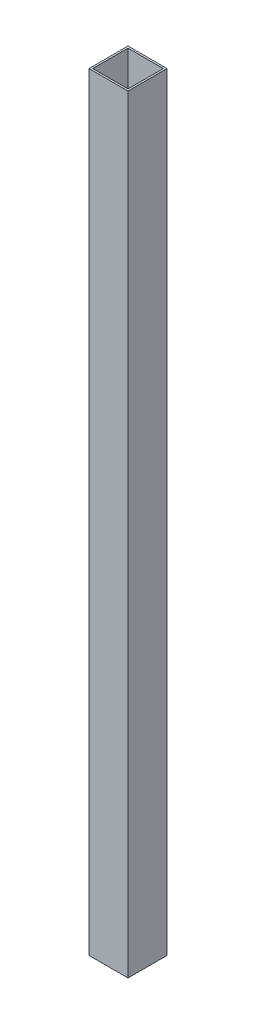
ISO-10303-21;
HEADER;
FILE_DESCRIPTION(('STEP AP214'),'2;1');
FILE_NAME('part.step','',(''),(''),'','','');
FILE_SCHEMA(('AUTOMOTIVE_DESIGN { 1 0 10303 214 1 1 1 1 }'));
ENDSEC;
DATA;
#1=APPLICATION_CONTEXT('core data for automotive mechanical design processes');
#2=APPLICATION_PROTOCOL_DEFINITION('international standard','automotive_design',2000,#1);
#3=PRODUCT_CONTEXT('',#1,'mechanical');
#4=PRODUCT('Part','Part','',(#3));
#5=PRODUCT_RELATED_PRODUCT_CATEGORY('part','',(#4));
#6=PRODUCT_DEFINITION_FORMATION('','',#4);
#7=PRODUCT_DEFINITION_CONTEXT('part definition',#1,'design');
#8=PRODUCT_DEFINITION('design','',#6,#7);
#9=PRODUCT_DEFINITION_SHAPE('','',#8);
#10=(LENGTH_UNIT() NAMED_UNIT(*) SI_UNIT(.MILLI.,.METRE.));
#11=(NAMED_UNIT(*) PLANE_ANGLE_UNIT() SI_UNIT($,.RADIAN.));
#12=(NAMED_UNIT(*) SI_UNIT($,.STERADIAN.) SOLID_ANGLE_UNIT());
#13=UNCERTAINTY_MEASURE_WITH_UNIT(LENGTH_MEASURE(1.E-05),#10,'distance_accuracy_value','');
#14=(GEOMETRIC_REPRESENTATION_CONTEXT(3) GLOBAL_UNCERTAINTY_ASSIGNED_CONTEXT((#13)) GLOBAL_UNIT_ASSIGNED_CONTEXT((#10,
#11,#12)) REPRESENTATION_CONTEXT('',''));
#15=CARTESIAN_POINT('',(0.,0.,0.));
#16=DIRECTION('',(0.,0.,1.));
#17=DIRECTION('',(1.,0.,0.));
#18=AXIS2_PLACEMENT_3D('',#15,#16,#17);
#19=CARTESIAN_POINT('',(0.,250.,0.));
#20=DIRECTION('',(0.,-1.,0.));
#21=DIRECTION('',(0.,0.,-1.));
#22=AXIS2_PLACEMENT_3D('',#19,#20,#21);
#23=PLANE('',#22);
#24=DIRECTION('',(0.,0.,-1.));
#25=VECTOR('',#24,1.);
#26=CARTESIAN_POINT('',(12.7,250.,12.7));
#27=LINE('',#26,#25);
#28=CARTESIAN_POINT('',(12.7,250.,12.7));
#29=VERTEX_POINT('',#28);
#30=CARTESIAN_POINT('',(12.7,250.,-12.7));
#31=VERTEX_POINT('',#30);
#32=EDGE_CURVE('E138',#29,#31,#27,.T.);
#33=ORIENTED_EDGE('',*,*,#32,.T.);
#34=DIRECTION('',(-1.,0.,0.));
#35=VECTOR('',#34,1.);
#36=CARTESIAN_POINT('',(-12.7,250.,-12.7));
#37=LINE('',#36,#35);
#38=CARTESIAN_POINT('',(-12.7,250.,-12.7));
#39=VERTEX_POINT('',#38);
#40=EDGE_CURVE('E141',#31,#39,#37,.T.);
#41=ORIENTED_EDGE('',*,*,#40,.T.);
#42=DIRECTION('',(0.,0.,1.));
#43=VECTOR('',#42,1.);
#44=CARTESIAN_POINT('',(-12.7,250.,12.7));
#45=LINE('',#44,#43);
#46=CARTESIAN_POINT('',(-12.7,250.,12.7));
#47=VERTEX_POINT('',#46);
#48=EDGE_CURVE('E144',#39,#47,#45,.T.);
#49=ORIENTED_EDGE('',*,*,#48,.T.);
#50=DIRECTION('',(1.,0.,0.));
#51=VECTOR('',#50,1.);
#52=CARTESIAN_POINT('',(-12.7,250.,12.7));
#53=LINE('',#52,#51);
#54=EDGE_CURVE('E146',#47,#29,#53,.T.);
#55=ORIENTED_EDGE('',*,*,#54,.T.);
#56=EDGE_LOOP('',(#33,#41,#49,#55));
#57=FACE_BOUND('',#56,.T.);
#58=DIRECTION('',(0.,0.,1.));
#59=VECTOR('',#58,1.);
#60=CARTESIAN_POINT('',(-11.5,250.,11.5));
#61=LINE('',#60,#59);
#62=CARTESIAN_POINT('',(-11.5,250.,-11.5));
#63=VERTEX_POINT('',#62);
#64=CARTESIAN_POINT('',(-11.5,250.,11.5));
#65=VERTEX_POINT('',#64);
#66=EDGE_CURVE('E102',#63,#65,#61,.T.);
#67=ORIENTED_EDGE('',*,*,#66,.F.);
#68=DIRECTION('',(-1.,0.,0.));
#69=VECTOR('',#68,1.);
#70=CARTESIAN_POINT('',(-11.5,250.,-11.5));
#71=LINE('',#70,#69);
#72=CARTESIAN_POINT('',(11.5,250.,-11.5));
#73=VERTEX_POINT('',#72);
#74=EDGE_CURVE('E124',#73,#63,#71,.T.);
#75=ORIENTED_EDGE('',*,*,#74,.F.);
#76=DIRECTION('',(0.,0.,-1.));
#77=VECTOR('',#76,1.);
#78=CARTESIAN_POINT('',(11.5,250.,11.5));
#79=LINE('',#78,#77);
#80=CARTESIAN_POINT('',(11.5,250.,11.5));
#81=VERTEX_POINT('',#80);
#82=EDGE_CURVE('E122',#81,#73,#79,.T.);
#83=ORIENTED_EDGE('',*,*,#82,.F.);
#84=DIRECTION('',(1.,0.,0.));
#85=VECTOR('',#84,1.);
#86=CARTESIAN_POINT('',(-11.5,250.,11.5));
#87=LINE('',#86,#85);
#88=EDGE_CURVE('E110',#65,#81,#87,.T.);
#89=ORIENTED_EDGE('',*,*,#88,.F.);
#90=EDGE_LOOP('',(#67,#75,#83,#89));
#91=FACE_BOUND('',#90,.T.);
#92=ADVANCED_FACE('F37',(#57,#91),#23,.F.);
#93=CARTESIAN_POINT('',(0.,-250.,0.));
#94=DIRECTION('',(0.,-1.,0.));
#95=DIRECTION('',(0.,0.,-1.));
#96=AXIS2_PLACEMENT_3D('',#93,#94,#95);
#97=PLANE('',#96);
#98=DIRECTION('',(0.,0.,-1.));
#99=VECTOR('',#98,1.);
#100=CARTESIAN_POINT('',(12.7,-250.,12.7));
#101=LINE('',#100,#99);
#102=CARTESIAN_POINT('',(12.7,-250.,12.7));
#103=VERTEX_POINT('',#102);
#104=CARTESIAN_POINT('',(12.7,-250.,-12.7));
#105=VERTEX_POINT('',#104);
#106=EDGE_CURVE('E118',#103,#105,#101,.T.);
#107=ORIENTED_EDGE('',*,*,#106,.F.);
#108=DIRECTION('',(1.,0.,0.));
#109=VECTOR('',#108,1.);
#110=CARTESIAN_POINT('',(-12.7,-250.,12.7));
#111=LINE('',#110,#109);
#112=CARTESIAN_POINT('',(-12.7,-250.,12.7));
#113=VERTEX_POINT('',#112);
#114=EDGE_CURVE('E142',#113,#103,#111,.T.);
#115=ORIENTED_EDGE('',*,*,#114,.F.);
#116=DIRECTION('',(0.,0.,1.));
#117=VECTOR('',#116,1.);
#118=CARTESIAN_POINT('',(-12.7,-250.,12.7));
#119=LINE('',#118,#117);
#120=CARTESIAN_POINT('',(-12.7,-250.,-12.7));
#121=VERTEX_POINT('',#120);
#122=EDGE_CURVE('E153',#121,#113,#119,.T.);
#123=ORIENTED_EDGE('',*,*,#122,.F.);
#124=DIRECTION('',(-1.,0.,0.));
#125=VECTOR('',#124,1.);
#126=CARTESIAN_POINT('',(-12.7,-250.,-12.7));
#127=LINE('',#126,#125);
#128=EDGE_CURVE('E151',#105,#121,#127,.T.);
#129=ORIENTED_EDGE('',*,*,#128,.F.);
#130=EDGE_LOOP('',(#107,#115,#123,#129));
#131=FACE_BOUND('',#130,.T.);
#132=DIRECTION('',(-1.,0.,0.));
#133=VECTOR('',#132,1.);
#134=CARTESIAN_POINT('',(-11.5,-250.,-11.5));
#135=LINE('',#134,#133);
#136=CARTESIAN_POINT('',(11.5,-250.,-11.5));
#137=VERTEX_POINT('',#136);
#138=CARTESIAN_POINT('',(-11.5,-250.,-11.5));
#139=VERTEX_POINT('',#138);
#140=EDGE_CURVE('E111',#137,#139,#135,.T.);
#141=ORIENTED_EDGE('',*,*,#140,.T.);
#142=DIRECTION('',(0.,0.,1.));
#143=VECTOR('',#142,1.);
#144=CARTESIAN_POINT('',(-11.5,-250.,11.5));
#145=LINE('',#144,#143);
#146=CARTESIAN_POINT('',(-11.5,-250.,11.5));
#147=VERTEX_POINT('',#146);
#148=EDGE_CURVE('E60',#139,#147,#145,.T.);
#149=ORIENTED_EDGE('',*,*,#148,.T.);
#150=DIRECTION('',(1.,0.,0.));
#151=VECTOR('',#150,1.);
#152=CARTESIAN_POINT('',(-11.5,-250.,11.5));
#153=LINE('',#152,#151);
#154=CARTESIAN_POINT('',(11.5,-250.,11.5));
#155=VERTEX_POINT('',#154);
#156=EDGE_CURVE('E117',#147,#155,#153,.T.);
#157=ORIENTED_EDGE('',*,*,#156,.T.);
#158=DIRECTION('',(0.,0.,-1.));
#159=VECTOR('',#158,1.);
#160=CARTESIAN_POINT('',(11.5,-250.,11.5));
#161=LINE('',#160,#159);
#162=EDGE_CURVE('E130',#155,#137,#161,.T.);
#163=ORIENTED_EDGE('',*,*,#162,.T.);
#164=EDGE_LOOP('',(#141,#149,#157,#163));
#165=FACE_BOUND('',#164,.T.);
#166=ADVANCED_FACE('F171',(#131,#165),#97,.T.);
#167=CARTESIAN_POINT('',(12.7,250.,12.7));
#168=DIRECTION('',(-1.,0.,0.));
#169=DIRECTION('',(0.,0.,1.));
#170=AXIS2_PLACEMENT_3D('',#167,#168,#169);
#171=PLANE('',#170);
#172=ORIENTED_EDGE('',*,*,#106,.T.);
#173=DIRECTION('',(0.,-1.,0.));
#174=VECTOR('',#173,1.);
#175=CARTESIAN_POINT('',(12.7,250.,-12.7));
#176=LINE('',#175,#174);
#177=EDGE_CURVE('E11',#31,#105,#176,.T.);
#178=ORIENTED_EDGE('',*,*,#177,.F.);
#179=ORIENTED_EDGE('',*,*,#32,.F.);
#180=DIRECTION('',(0.,-1.,0.));
#181=VECTOR('',#180,1.);
#182=CARTESIAN_POINT('',(12.7,250.,12.7));
#183=LINE('',#182,#181);
#184=EDGE_CURVE('E148',#29,#103,#183,.T.);
#185=ORIENTED_EDGE('',*,*,#184,.T.);
#186=EDGE_LOOP('',(#172,#178,#179,#185));
#187=FACE_BOUND('',#186,.T.);
#188=ADVANCED_FACE('F39',(#187),#171,.F.);
#189=CARTESIAN_POINT('',(-12.7,250.,-12.7));
#190=DIRECTION('',(0.,0.,1.));
#191=DIRECTION('',(1.,0.,0.));
#192=AXIS2_PLACEMENT_3D('',#189,#190,#191);
#193=PLANE('',#192);
#194=ORIENTED_EDGE('',*,*,#128,.T.);
#195=DIRECTION('',(0.,-1.,0.));
#196=VECTOR('',#195,1.);
#197=CARTESIAN_POINT('',(-12.7,250.,-12.7));
#198=LINE('',#197,#196);
#199=EDGE_CURVE('E45',#39,#121,#198,.T.);
#200=ORIENTED_EDGE('',*,*,#199,.F.);
#201=ORIENTED_EDGE('',*,*,#40,.F.);
#202=ORIENTED_EDGE('',*,*,#177,.T.);
#203=EDGE_LOOP('',(#194,#200,#201,#202));
#204=FACE_BOUND('',#203,.T.);
#205=ADVANCED_FACE('F181',(#204),#193,.F.);
#206=CARTESIAN_POINT('',(-12.7,250.,12.7));
#207=DIRECTION('',(1.,0.,0.));
#208=DIRECTION('',(0.,0.,-1.));
#209=AXIS2_PLACEMENT_3D('',#206,#207,#208);
#210=PLANE('',#209);
#211=ORIENTED_EDGE('',*,*,#122,.T.);
#212=DIRECTION('',(0.,-1.,0.));
#213=VECTOR('',#212,1.);
#214=CARTESIAN_POINT('',(-12.7,250.,12.7));
#215=LINE('',#214,#213);
#216=EDGE_CURVE('E158',#47,#113,#215,.T.);
#217=ORIENTED_EDGE('',*,*,#216,.F.);
#218=ORIENTED_EDGE('',*,*,#48,.F.);
#219=ORIENTED_EDGE('',*,*,#199,.T.);
#220=EDGE_LOOP('',(#211,#217,#218,#219));
#221=FACE_BOUND('',#220,.T.);
#222=ADVANCED_FACE('F165',(#221),#210,.F.);
#223=CARTESIAN_POINT('',(-12.7,250.,12.7));
#224=DIRECTION('',(0.,0.,-1.));
#225=DIRECTION('',(-1.,0.,0.));
#226=AXIS2_PLACEMENT_3D('',#223,#224,#225);
#227=PLANE('',#226);
#228=ORIENTED_EDGE('',*,*,#114,.T.);
#229=ORIENTED_EDGE('',*,*,#184,.F.);
#230=ORIENTED_EDGE('',*,*,#54,.F.);
#231=ORIENTED_EDGE('',*,*,#216,.T.);
#232=EDGE_LOOP('',(#228,#229,#230,#231));
#233=FACE_BOUND('',#232,.T.);
#234=ADVANCED_FACE('F175',(#233),#227,.F.);
#235=CARTESIAN_POINT('',(-11.5,250.,11.5));
#236=DIRECTION('',(1.,0.,0.));
#237=DIRECTION('',(0.,0.,-1.));
#238=AXIS2_PLACEMENT_3D('',#235,#236,#237);
#239=PLANE('',#238);
#240=ORIENTED_EDGE('',*,*,#148,.F.);
#241=DIRECTION('',(0.,-1.,0.));
#242=VECTOR('',#241,1.);
#243=CARTESIAN_POINT('',(-11.5,250.,-11.5));
#244=LINE('',#243,#242);
#245=EDGE_CURVE('E106',#63,#139,#244,.T.);
#246=ORIENTED_EDGE('',*,*,#245,.F.);
#247=ORIENTED_EDGE('',*,*,#66,.T.);
#248=DIRECTION('',(0.,-1.,0.));
#249=VECTOR('',#248,1.);
#250=CARTESIAN_POINT('',(-11.5,250.,11.5));
#251=LINE('',#250,#249);
#252=EDGE_CURVE('E105',#65,#147,#251,.T.);
#253=ORIENTED_EDGE('',*,*,#252,.T.);
#254=EDGE_LOOP('',(#240,#246,#247,#253));
#255=FACE_BOUND('',#254,.T.);
#256=ADVANCED_FACE('F104',(#255),#239,.T.);
#257=CARTESIAN_POINT('',(-11.5,250.,11.5));
#258=DIRECTION('',(0.,0.,-1.));
#259=DIRECTION('',(-1.,0.,0.));
#260=AXIS2_PLACEMENT_3D('',#257,#258,#259);
#261=PLANE('',#260);
#262=ORIENTED_EDGE('',*,*,#156,.F.);
#263=ORIENTED_EDGE('',*,*,#252,.F.);
#264=ORIENTED_EDGE('',*,*,#88,.T.);
#265=DIRECTION('',(0.,-1.,0.));
#266=VECTOR('',#265,1.);
#267=CARTESIAN_POINT('',(11.5,250.,11.5));
#268=LINE('',#267,#266);
#269=EDGE_CURVE('E119',#81,#155,#268,.T.);
#270=ORIENTED_EDGE('',*,*,#269,.T.);
#271=EDGE_LOOP('',(#262,#263,#264,#270));
#272=FACE_BOUND('',#271,.T.);
#273=ADVANCED_FACE('F114',(#272),#261,.T.);
#274=CARTESIAN_POINT('',(11.5,250.,11.5));
#275=DIRECTION('',(-1.,0.,0.));
#276=DIRECTION('',(0.,0.,1.));
#277=AXIS2_PLACEMENT_3D('',#274,#275,#276);
#278=PLANE('',#277);
#279=ORIENTED_EDGE('',*,*,#162,.F.);
#280=ORIENTED_EDGE('',*,*,#269,.F.);
#281=ORIENTED_EDGE('',*,*,#82,.T.);
#282=DIRECTION('',(0.,-1.,0.));
#283=VECTOR('',#282,1.);
#284=CARTESIAN_POINT('',(11.5,250.,-11.5));
#285=LINE('',#284,#283);
#286=EDGE_CURVE('E52',#73,#137,#285,.T.);
#287=ORIENTED_EDGE('',*,*,#286,.T.);
#288=EDGE_LOOP('',(#279,#280,#281,#287));
#289=FACE_BOUND('',#288,.T.);
#290=ADVANCED_FACE('F204',(#289),#278,.T.);
#291=CARTESIAN_POINT('',(-11.5,250.,-11.5));
#292=DIRECTION('',(0.,0.,1.));
#293=DIRECTION('',(1.,0.,0.));
#294=AXIS2_PLACEMENT_3D('',#291,#292,#293);
#295=PLANE('',#294);
#296=ORIENTED_EDGE('',*,*,#140,.F.);
#297=ORIENTED_EDGE('',*,*,#286,.F.);
#298=ORIENTED_EDGE('',*,*,#74,.T.);
#299=ORIENTED_EDGE('',*,*,#245,.T.);
#300=EDGE_LOOP('',(#296,#297,#298,#299));
#301=FACE_BOUND('',#300,.T.);
#302=ADVANCED_FACE('F208',(#301),#295,.T.);
#303=CLOSED_SHELL('',(#92,#166,#188,#205,#222,#234,#256,#273,#290,#302));
#304=MANIFOLD_SOLID_BREP('B2',#303);
#305=ADVANCED_BREP_SHAPE_REPRESENTATION('',(#18,#304),#14);
#306=SHAPE_DEFINITION_REPRESENTATION(#9,#305);
ENDSEC;
END-ISO-10303-21;
